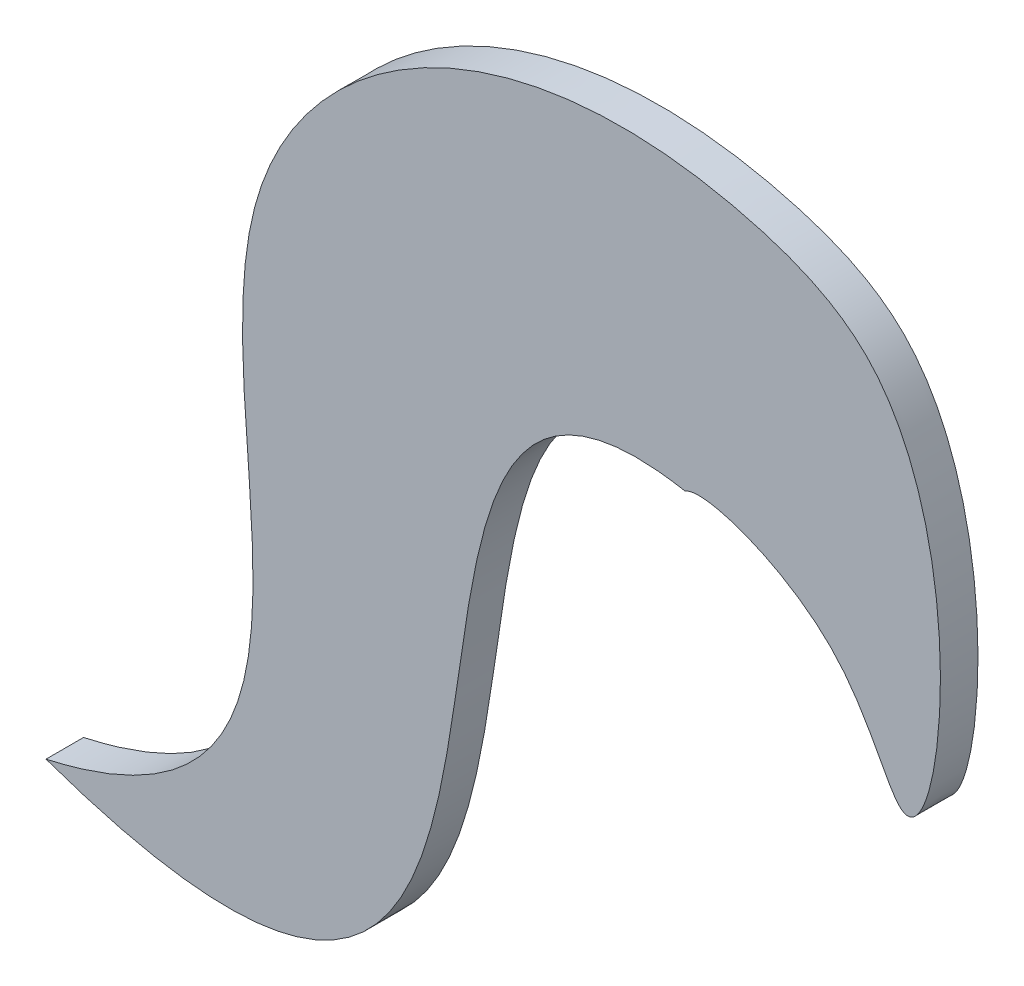
ISO-10303-21;
HEADER;
FILE_DESCRIPTION(('STEP AP214'),'2;1');
FILE_NAME('part.step','',(''),(''),'','','');
FILE_SCHEMA(('AUTOMOTIVE_DESIGN { 1 0 10303 214 1 1 1 1 }'));
ENDSEC;
DATA;
#1=APPLICATION_CONTEXT('core data for automotive mechanical design processes');
#2=APPLICATION_PROTOCOL_DEFINITION('international standard','automotive_design',2000,#1);
#3=PRODUCT_CONTEXT('',#1,'mechanical');
#4=PRODUCT('Part','Part','',(#3));
#5=PRODUCT_RELATED_PRODUCT_CATEGORY('part','',(#4));
#6=PRODUCT_DEFINITION_FORMATION('','',#4);
#7=PRODUCT_DEFINITION_CONTEXT('part definition',#1,'design');
#8=PRODUCT_DEFINITION('design','',#6,#7);
#9=PRODUCT_DEFINITION_SHAPE('','',#8);
#10=(LENGTH_UNIT() NAMED_UNIT(*) SI_UNIT(.MILLI.,.METRE.));
#11=(NAMED_UNIT(*) PLANE_ANGLE_UNIT() SI_UNIT($,.RADIAN.));
#12=(NAMED_UNIT(*) SI_UNIT($,.STERADIAN.) SOLID_ANGLE_UNIT());
#13=UNCERTAINTY_MEASURE_WITH_UNIT(LENGTH_MEASURE(1.E-05),#10,'distance_accuracy_value','');
#14=(GEOMETRIC_REPRESENTATION_CONTEXT(3) GLOBAL_UNCERTAINTY_ASSIGNED_CONTEXT((#13)) GLOBAL_UNIT_ASSIGNED_CONTEXT((#10,
#11,#12)) REPRESENTATION_CONTEXT('',''));
#15=CARTESIAN_POINT('',(0.,0.,0.));
#16=DIRECTION('',(0.,0.,1.));
#17=DIRECTION('',(1.,0.,0.));
#18=AXIS2_PLACEMENT_3D('',#15,#16,#17);
#19=CARTESIAN_POINT('',(51.0688946896589,44.0612244897959,3.));
#20=CARTESIAN_POINT('',(52.4496104922325,45.070691139678,3.));
#21=CARTESIAN_POINT('',(64.1517703834784,41.2921368343925,3.));
#22=CARTESIAN_POINT('',(70.7451469129852,20.0339741672124,3.));
#23=CARTESIAN_POINT('',(74.8491612237368,58.5217848109107,3.));
#24=CARTESIAN_POINT('',(40.1295824633237,72.1443183586769,3.));
#25=CARTESIAN_POINT('',(0.152368527039758,48.8360790584219,3.));
#26=CARTESIAN_POINT('',(26.5497081186274,5.87429187347188,3.));
#27=CARTESIAN_POINT('',(0.,0.,3.));
#28=B_SPLINE_CURVE_WITH_KNOTS('',3,(#19,#20,#21,#22,#23,#24,#25,#26,#27),.UNSPECIFIED.,.F.,.F.,
(4,1,1,1,1,1,4),(0.,0.0850271879338108,0.147811229465855,0.315280178769824,0.3652559032875,
0.647568474642619,1.),.UNSPECIFIED.);
#29=DIRECTION('',(0.,0.,-1.));
#30=VECTOR('',#29,1.);
#31=SURFACE_OF_LINEAR_EXTRUSION('',#28,#30);
#32=CARTESIAN_POINT('',(51.0688946896589,44.0612244897959,0.));
#33=CARTESIAN_POINT('',(52.4496104922325,45.070691139678,0.));
#34=CARTESIAN_POINT('',(64.1517703834784,41.2921368343925,0.));
#35=CARTESIAN_POINT('',(70.7451469129852,20.0339741672124,0.));
#36=CARTESIAN_POINT('',(74.8491612237368,58.5217848109107,0.));
#37=CARTESIAN_POINT('',(40.1295824633237,72.1443183586769,0.));
#38=CARTESIAN_POINT('',(0.152368527039758,48.8360790584219,0.));
#39=CARTESIAN_POINT('',(26.5497081186274,5.87429187347188,0.));
#40=CARTESIAN_POINT('',(0.,0.,0.));
#41=B_SPLINE_CURVE_WITH_KNOTS('',3,(#32,#33,#34,#35,#36,#37,#38,#39,#40),.UNSPECIFIED.,.F.,.F.,
(4,1,1,1,1,1,4),(0.,0.0850271879338108,0.147811229465855,0.315280178769824,0.3652559032875,
0.647568474642619,1.),.UNSPECIFIED.);
#42=CARTESIAN_POINT('',(51.0688946896589,44.0612244897959,0.));
#43=VERTEX_POINT('',#42);
#44=CARTESIAN_POINT('',(0.,0.,0.));
#45=VERTEX_POINT('',#44);
#46=EDGE_CURVE('E77',#43,#45,#41,.T.);
#47=ORIENTED_EDGE('',*,*,#46,.T.);
#48=DIRECTION('',(0.,0.,-1.));
#49=VECTOR('',#48,1.);
#50=CARTESIAN_POINT('',(0.,0.,3.));
#51=LINE('',#50,#49);
#52=CARTESIAN_POINT('',(0.,0.,3.));
#53=VERTEX_POINT('',#52);
#54=EDGE_CURVE('E11',#53,#45,#51,.T.);
#55=ORIENTED_EDGE('',*,*,#54,.F.);
#56=CARTESIAN_POINT('',(51.0688946896589,44.0612244897959,3.));
#57=VERTEX_POINT('',#56);
#58=EDGE_CURVE('E76',#57,#53,#28,.T.);
#59=ORIENTED_EDGE('',*,*,#58,.F.);
#60=DIRECTION('',(0.,0.,-1.));
#61=VECTOR('',#60,1.);
#62=CARTESIAN_POINT('',(51.0688946896589,44.0612244897959,3.));
#63=LINE('',#62,#61);
#64=EDGE_CURVE('E53',#57,#43,#63,.T.);
#65=ORIENTED_EDGE('',*,*,#64,.T.);
#66=EDGE_LOOP('',(#47,#55,#59,#65));
#67=FACE_BOUND('',#66,.T.);
#68=ADVANCED_FACE('F43',(#67),#31,.F.);
#69=CARTESIAN_POINT('',(0.,0.,3.));
#70=CARTESIAN_POINT('',(50.6964374645503,-17.8659365213765,3.));
#71=CARTESIAN_POINT('',(18.2223632923641,50.1585482676795,3.));
#72=CARTESIAN_POINT('',(51.0688946896589,44.0612244897959,3.));
#73=B_SPLINE_CURVE_WITH_KNOTS('',3,(#69,#70,#71,#72),.UNSPECIFIED.,.F.,.F.,(4,4),(0.,1.),.UNSPECIFIED.);
#74=DIRECTION('',(0.,0.,-1.));
#75=VECTOR('',#74,1.);
#76=SURFACE_OF_LINEAR_EXTRUSION('',#73,#75);
#77=CARTESIAN_POINT('',(0.,0.,0.));
#78=CARTESIAN_POINT('',(50.6964374645503,-17.8659365213765,0.));
#79=CARTESIAN_POINT('',(18.2223632923641,50.1585482676795,0.));
#80=CARTESIAN_POINT('',(51.0688946896589,44.0612244897959,0.));
#81=B_SPLINE_CURVE_WITH_KNOTS('',3,(#77,#78,#79,#80),.UNSPECIFIED.,.F.,.F.,(4,4),(0.,1.),.UNSPECIFIED.);
#82=EDGE_CURVE('E68',#45,#43,#81,.T.);
#83=ORIENTED_EDGE('',*,*,#82,.T.);
#84=ORIENTED_EDGE('',*,*,#64,.F.);
#85=EDGE_CURVE('E60',#53,#57,#73,.T.);
#86=ORIENTED_EDGE('',*,*,#85,.F.);
#87=ORIENTED_EDGE('',*,*,#54,.T.);
#88=EDGE_LOOP('',(#83,#84,#86,#87));
#89=FACE_BOUND('',#88,.T.);
#90=ADVANCED_FACE('F71',(#89),#76,.F.);
#91=CARTESIAN_POINT('',(31.838171276014,63.7337553360697,3.));
#92=DIRECTION('',(0.,0.,-1.));
#93=DIRECTION('',(-1.,0.,0.));
#94=AXIS2_PLACEMENT_3D('',#91,#92,#93);
#95=PLANE('',#94);
#96=ORIENTED_EDGE('',*,*,#58,.T.);
#97=ORIENTED_EDGE('',*,*,#85,.T.);
#98=EDGE_LOOP('',(#96,#97));
#99=FACE_BOUND('',#98,.T.);
#100=ADVANCED_FACE('F107',(#99),#95,.F.);
#101=CARTESIAN_POINT('',(31.838171276014,63.7337553360697,0.));
#102=DIRECTION('',(0.,0.,-1.));
#103=DIRECTION('',(-1.,0.,0.));
#104=AXIS2_PLACEMENT_3D('',#101,#102,#103);
#105=PLANE('',#104);
#106=ORIENTED_EDGE('',*,*,#46,.F.);
#107=ORIENTED_EDGE('',*,*,#82,.F.);
#108=EDGE_LOOP('',(#106,#107));
#109=FACE_BOUND('',#108,.T.);
#110=ADVANCED_FACE('F81',(#109),#105,.T.);
#111=CLOSED_SHELL('',(#68,#90,#100,#110));
#112=MANIFOLD_SOLID_BREP('B2',#111);
#113=ADVANCED_BREP_SHAPE_REPRESENTATION('',(#18,#112),#14);
#114=SHAPE_DEFINITION_REPRESENTATION(#9,#113);
ENDSEC;
END-ISO-10303-21;
